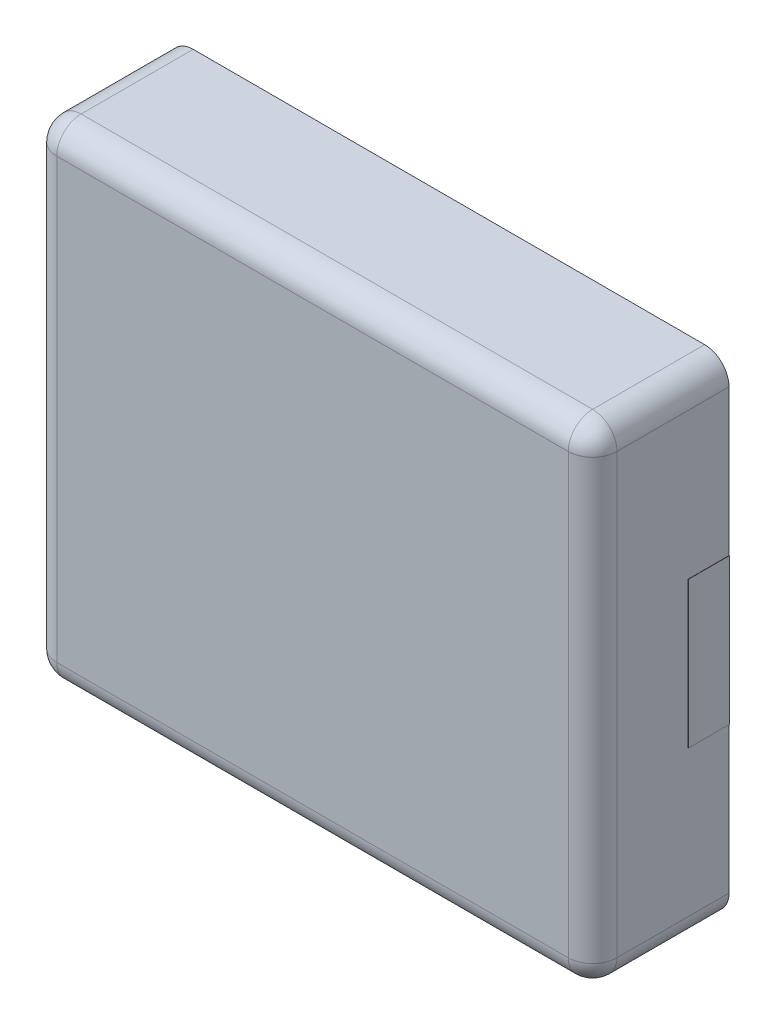
ISO-10303-21;
HEADER;
FILE_DESCRIPTION(('STEP AP214'),'2;1');
FILE_NAME('part.step','',(''),(''),'','','');
FILE_SCHEMA(('AUTOMOTIVE_DESIGN { 1 0 10303 214 1 1 1 1 }'));
ENDSEC;
DATA;
#1=APPLICATION_CONTEXT('core data for automotive mechanical design processes');
#2=APPLICATION_PROTOCOL_DEFINITION('international standard','automotive_design',2000,#1);
#3=PRODUCT_CONTEXT('',#1,'mechanical');
#4=PRODUCT('Part','Part','',(#3));
#5=PRODUCT_RELATED_PRODUCT_CATEGORY('part','',(#4));
#6=PRODUCT_DEFINITION_FORMATION('','',#4);
#7=PRODUCT_DEFINITION_CONTEXT('part definition',#1,'design');
#8=PRODUCT_DEFINITION('design','',#6,#7);
#9=PRODUCT_DEFINITION_SHAPE('','',#8);
#10=(LENGTH_UNIT() NAMED_UNIT(*) SI_UNIT(.MILLI.,.METRE.));
#11=(NAMED_UNIT(*) PLANE_ANGLE_UNIT() SI_UNIT($,.RADIAN.));
#12=(NAMED_UNIT(*) SI_UNIT($,.STERADIAN.) SOLID_ANGLE_UNIT());
#13=UNCERTAINTY_MEASURE_WITH_UNIT(LENGTH_MEASURE(1.E-05),#10,'distance_accuracy_value','');
#14=(GEOMETRIC_REPRESENTATION_CONTEXT(3) GLOBAL_UNCERTAINTY_ASSIGNED_CONTEXT((#13)) GLOBAL_UNIT_ASSIGNED_CONTEXT((#10,
#11,#12)) REPRESENTATION_CONTEXT('',''));
#15=CARTESIAN_POINT('',(0.,0.,0.));
#16=DIRECTION('',(0.,0.,1.));
#17=DIRECTION('',(1.,0.,0.));
#18=AXIS2_PLACEMENT_3D('',#15,#16,#17);
#19=CARTESIAN_POINT('',(5.25,-4.5,2.3));
#20=DIRECTION('',(0.,0.,1.));
#21=DIRECTION('',(1.,0.,0.));
#22=AXIS2_PLACEMENT_3D('',#19,#20,#21);
#23=SPHERICAL_SURFACE('',#22,0.5);
#24=CARTESIAN_POINT('',(5.25,-4.5,2.3));
#25=DIRECTION('',(-1.,0.,0.));
#26=DIRECTION('',(0.,-1.,0.));
#27=AXIS2_PLACEMENT_3D('',#24,#25,#26);
#28=CIRCLE('',#27,0.5);
#29=CARTESIAN_POINT('',(5.25,-5.,2.3));
#30=VERTEX_POINT('',#29);
#31=CARTESIAN_POINT('',(5.25,-4.5,2.8));
#32=VERTEX_POINT('',#31);
#33=EDGE_CURVE('P0_E35',#30,#32,#28,.T.);
#34=ORIENTED_EDGE('',*,*,#33,.F.);
#35=CARTESIAN_POINT('',(5.25,-4.5,2.3));
#36=DIRECTION('',(0.,0.,-1.));
#37=DIRECTION('',(1.,0.,0.));
#38=AXIS2_PLACEMENT_3D('',#35,#36,#37);
#39=CIRCLE('',#38,0.5);
#40=CARTESIAN_POINT('',(5.75,-4.5,2.3));
#41=VERTEX_POINT('',#40);
#42=EDGE_CURVE('P0_E128',#41,#30,#39,.T.);
#43=ORIENTED_EDGE('',*,*,#42,.F.);
#44=CARTESIAN_POINT('',(5.25,-4.5,2.3));
#45=DIRECTION('',(0.,-1.,0.));
#46=DIRECTION('',(1.,0.,0.));
#47=AXIS2_PLACEMENT_3D('',#44,#45,#46);
#48=CIRCLE('',#47,0.5);
#49=EDGE_CURVE('P0_E10',#41,#32,#48,.T.);
#50=ORIENTED_EDGE('',*,*,#49,.T.);
#51=EDGE_LOOP('',(#34,#43,#50));
#52=FACE_BOUND('',#51,.T.);
#53=ADVANCED_FACE('P0_F16',(#52),#23,.T.);
#54=CARTESIAN_POINT('',(3.745,-1.5,0.84));
#55=DIRECTION('',(0.,0.,1.));
#56=DIRECTION('',(1.,0.,0.));
#57=AXIS2_PLACEMENT_3D('',#54,#55,#56);
#58=PLANE('',#57);
#59=DIRECTION('',(0.,-1.,0.));
#60=VECTOR('',#59,1.);
#61=CARTESIAN_POINT('',(5.75,-3.25,0.84));
#62=LINE('',#61,#60);
#63=CARTESIAN_POINT('',(5.75,1.5,0.84));
#64=VERTEX_POINT('',#63);
#65=CARTESIAN_POINT('',(5.75,-1.5,0.84));
#66=VERTEX_POINT('',#65);
#67=EDGE_CURVE('P0_E81',#64,#66,#62,.T.);
#68=ORIENTED_EDGE('',*,*,#67,.T.);
#69=DIRECTION('',(1.,0.,0.));
#70=VECTOR('',#69,1.);
#71=CARTESIAN_POINT('',(3.745,-1.5,0.84));
#72=LINE('',#71,#70);
#73=CARTESIAN_POINT('',(3.745,-1.5,0.84));
#74=VERTEX_POINT('',#73);
#75=EDGE_CURVE('P0_E48',#74,#66,#72,.T.);
#76=ORIENTED_EDGE('',*,*,#75,.F.);
#77=DIRECTION('',(0.,1.,0.));
#78=VECTOR('',#77,1.);
#79=CARTESIAN_POINT('',(3.745,-1.5,0.84));
#80=LINE('',#79,#78);
#81=CARTESIAN_POINT('',(3.745,1.5,0.84));
#82=VERTEX_POINT('',#81);
#83=EDGE_CURVE('P0_E83',#74,#82,#80,.T.);
#84=ORIENTED_EDGE('',*,*,#83,.T.);
#85=DIRECTION('',(1.,0.,0.));
#86=VECTOR('',#85,1.);
#87=CARTESIAN_POINT('',(3.745,1.5,0.84));
#88=LINE('',#87,#86);
#89=EDGE_CURVE('P0_E77',#82,#64,#88,.T.);
#90=ORIENTED_EDGE('',*,*,#89,.T.);
#91=EDGE_LOOP('',(#68,#76,#84,#90));
#92=FACE_BOUND('',#91,.T.);
#93=ADVANCED_FACE('P0_F79',(#92),#58,.F.);
#94=CARTESIAN_POINT('',(5.25,4.5,2.3));
#95=DIRECTION('',(0.,0.,1.));
#96=DIRECTION('',(0.,1.,0.));
#97=AXIS2_PLACEMENT_3D('',#94,#95,#96);
#98=SPHERICAL_SURFACE('',#97,0.5);
#99=CARTESIAN_POINT('',(5.25,4.5,2.3));
#100=DIRECTION('',(0.,-1.,0.));
#101=DIRECTION('',(1.,0.,0.));
#102=AXIS2_PLACEMENT_3D('',#99,#100,#101);
#103=CIRCLE('',#102,0.5);
#104=CARTESIAN_POINT('',(5.75,4.5,2.3));
#105=VERTEX_POINT('',#104);
#106=CARTESIAN_POINT('',(5.25,4.5,2.8));
#107=VERTEX_POINT('',#106);
#108=EDGE_CURVE('P0_E19',#105,#107,#103,.T.);
#109=ORIENTED_EDGE('',*,*,#108,.F.);
#110=CARTESIAN_POINT('',(5.25,4.5,2.3));
#111=DIRECTION('',(0.,0.,-1.));
#112=DIRECTION('',(0.,1.,0.));
#113=AXIS2_PLACEMENT_3D('',#110,#111,#112);
#114=CIRCLE('',#113,0.5);
#115=CARTESIAN_POINT('',(5.25,5.,2.3));
#116=VERTEX_POINT('',#115);
#117=EDGE_CURVE('P0_E154',#116,#105,#114,.T.);
#118=ORIENTED_EDGE('',*,*,#117,.F.);
#119=CARTESIAN_POINT('',(5.25,4.5,2.3));
#120=DIRECTION('',(1.,0.,0.));
#121=DIRECTION('',(0.,1.,0.));
#122=AXIS2_PLACEMENT_3D('',#119,#120,#121);
#123=CIRCLE('',#122,0.5);
#124=EDGE_CURVE('P0_E134',#116,#107,#123,.T.);
#125=ORIENTED_EDGE('',*,*,#124,.T.);
#126=EDGE_LOOP('',(#109,#118,#125));
#127=FACE_BOUND('',#126,.T.);
#128=ADVANCED_FACE('P0_F153',(#127),#98,.T.);
#129=CARTESIAN_POINT('',(5.25,4.5,2.3));
#130=DIRECTION('',(0.,-1.,0.));
#131=DIRECTION('',(1.,0.,0.));
#132=AXIS2_PLACEMENT_3D('',#129,#130,#131);
#133=CYLINDRICAL_SURFACE('',#132,0.5);
#134=ORIENTED_EDGE('',*,*,#108,.T.);
#135=DIRECTION('',(0.,-1.,0.));
#136=VECTOR('',#135,1.);
#137=CARTESIAN_POINT('',(5.25,4.5,2.8));
#138=LINE('',#137,#136);
#139=EDGE_CURVE('P0_E149',#107,#32,#138,.T.);
#140=ORIENTED_EDGE('',*,*,#139,.T.);
#141=ORIENTED_EDGE('',*,*,#49,.F.);
#142=DIRECTION('',(0.,-1.,0.));
#143=VECTOR('',#142,1.);
#144=CARTESIAN_POINT('',(5.75,4.5,2.3));
#145=LINE('',#144,#143);
#146=EDGE_CURVE('P0_E151',#105,#41,#145,.T.);
#147=ORIENTED_EDGE('',*,*,#146,.F.);
#148=EDGE_LOOP('',(#134,#140,#141,#147));
#149=FACE_BOUND('',#148,.T.);
#150=ADVANCED_FACE('P0_F147',(#149),#133,.T.);
#151=CARTESIAN_POINT('',(-5.25,4.5,2.3));
#152=DIRECTION('',(1.,0.,0.));
#153=DIRECTION('',(0.,1.,0.));
#154=AXIS2_PLACEMENT_3D('',#151,#152,#153);
#155=CYLINDRICAL_SURFACE('',#154,0.5);
#156=CARTESIAN_POINT('',(-5.25,4.5,2.3));
#157=DIRECTION('',(1.,0.,0.));
#158=DIRECTION('',(0.,1.,0.));
#159=AXIS2_PLACEMENT_3D('',#156,#157,#158);
#160=CIRCLE('',#159,0.5);
#161=CARTESIAN_POINT('',(-5.25,5.,2.3));
#162=VERTEX_POINT('',#161);
#163=CARTESIAN_POINT('',(-5.25,4.5,2.8));
#164=VERTEX_POINT('',#163);
#165=EDGE_CURVE('P0_E187',#162,#164,#160,.T.);
#166=ORIENTED_EDGE('',*,*,#165,.T.);
#167=DIRECTION('',(1.,0.,0.));
#168=VECTOR('',#167,1.);
#169=CARTESIAN_POINT('',(-5.25,4.5,2.8));
#170=LINE('',#169,#168);
#171=EDGE_CURVE('P0_E192',#164,#107,#170,.T.);
#172=ORIENTED_EDGE('',*,*,#171,.T.);
#173=ORIENTED_EDGE('',*,*,#124,.F.);
#174=DIRECTION('',(1.,0.,0.));
#175=VECTOR('',#174,1.);
#176=CARTESIAN_POINT('',(-5.25,5.,2.3));
#177=LINE('',#176,#175);
#178=EDGE_CURVE('P0_E174',#162,#116,#177,.T.);
#179=ORIENTED_EDGE('',*,*,#178,.F.);
#180=EDGE_LOOP('',(#166,#172,#173,#179));
#181=FACE_BOUND('',#180,.T.);
#182=ADVANCED_FACE('P0_F355',(#181),#155,.T.);
#183=CARTESIAN_POINT('',(5.25,-4.5,2.3));
#184=DIRECTION('',(-1.,0.,0.));
#185=DIRECTION('',(0.,-1.,0.));
#186=AXIS2_PLACEMENT_3D('',#183,#184,#185);
#187=CYLINDRICAL_SURFACE('',#186,0.5);
#188=ORIENTED_EDGE('',*,*,#33,.T.);
#189=DIRECTION('',(-1.,0.,0.));
#190=VECTOR('',#189,1.);
#191=CARTESIAN_POINT('',(5.25,-4.5,2.8));
#192=LINE('',#191,#190);
#193=CARTESIAN_POINT('',(-5.25,-4.5,2.8));
#194=VERTEX_POINT('',#193);
#195=EDGE_CURVE('P0_E244',#32,#194,#192,.T.);
#196=ORIENTED_EDGE('',*,*,#195,.T.);
#197=CARTESIAN_POINT('',(-5.25,-4.5,2.3));
#198=DIRECTION('',(-1.,0.,0.));
#199=DIRECTION('',(0.,-1.,0.));
#200=AXIS2_PLACEMENT_3D('',#197,#198,#199);
#201=CIRCLE('',#200,0.5);
#202=CARTESIAN_POINT('',(-5.25,-5.,2.3));
#203=VERTEX_POINT('',#202);
#204=EDGE_CURVE('P0_E240',#203,#194,#201,.T.);
#205=ORIENTED_EDGE('',*,*,#204,.F.);
#206=DIRECTION('',(-1.,0.,0.));
#207=VECTOR('',#206,1.);
#208=CARTESIAN_POINT('',(5.25,-5.,2.3));
#209=LINE('',#208,#207);
#210=EDGE_CURVE('P0_E127',#30,#203,#209,.T.);
#211=ORIENTED_EDGE('',*,*,#210,.F.);
#212=EDGE_LOOP('',(#188,#196,#205,#211));
#213=FACE_BOUND('',#212,.T.);
#214=ADVANCED_FACE('P0_F326',(#213),#187,.T.);
#215=CARTESIAN_POINT('',(-5.75,-5.,0.));
#216=DIRECTION('',(0.,1.,0.));
#217=DIRECTION('',(1.,0.,0.));
#218=AXIS2_PLACEMENT_3D('',#215,#216,#217);
#219=PLANE('',#218);
#220=DIRECTION('',(1.,0.,0.));
#221=VECTOR('',#220,1.);
#222=CARTESIAN_POINT('',(-5.75,-5.,0.));
#223=LINE('',#222,#221);
#224=CARTESIAN_POINT('',(-5.25,-5.,0.));
#225=VERTEX_POINT('',#224);
#226=CARTESIAN_POINT('',(5.25,-5.,0.));
#227=VERTEX_POINT('',#226);
#228=EDGE_CURVE('P0_E217',#225,#227,#223,.T.);
#229=ORIENTED_EDGE('',*,*,#228,.T.);
#230=DIRECTION('',(0.,0.,1.));
#231=VECTOR('',#230,1.);
#232=CARTESIAN_POINT('',(5.25,-5.,0.));
#233=LINE('',#232,#231);
#234=EDGE_CURVE('P0_E123',#227,#30,#233,.T.);
#235=ORIENTED_EDGE('',*,*,#234,.T.);
#236=ORIENTED_EDGE('',*,*,#210,.T.);
#237=DIRECTION('',(0.,0.,1.));
#238=VECTOR('',#237,1.);
#239=CARTESIAN_POINT('',(-5.25,-5.,0.));
#240=LINE('',#239,#238);
#241=EDGE_CURVE('P0_E241',#225,#203,#240,.T.);
#242=ORIENTED_EDGE('',*,*,#241,.F.);
#243=EDGE_LOOP('',(#229,#235,#236,#242));
#244=FACE_BOUND('',#243,.T.);
#245=ADVANCED_FACE('P0_F329',(#244),#219,.F.);
#246=CARTESIAN_POINT('',(5.25,-4.5,0.));
#247=DIRECTION('',(0.,0.,1.));
#248=DIRECTION('',(1.,0.,0.));
#249=AXIS2_PLACEMENT_3D('',#246,#247,#248);
#250=CYLINDRICAL_SURFACE('',#249,0.5);
#251=ORIENTED_EDGE('',*,*,#42,.T.);
#252=ORIENTED_EDGE('',*,*,#234,.F.);
#253=CARTESIAN_POINT('',(5.25,-4.5,0.));
#254=DIRECTION('',(0.,0.,-1.));
#255=DIRECTION('',(0.,-1.,0.));
#256=AXIS2_PLACEMENT_3D('',#253,#254,#255);
#257=CIRCLE('',#256,0.5);
#258=CARTESIAN_POINT('',(5.75,-4.5,0.));
#259=VERTEX_POINT('',#258);
#260=EDGE_CURVE('P0_E214',#259,#227,#257,.T.);
#261=ORIENTED_EDGE('',*,*,#260,.F.);
#262=DIRECTION('',(0.,0.,1.));
#263=VECTOR('',#262,1.);
#264=CARTESIAN_POINT('',(5.75,-4.5,0.));
#265=LINE('',#264,#263);
#266=EDGE_CURVE('P0_E111',#259,#41,#265,.T.);
#267=ORIENTED_EDGE('',*,*,#266,.T.);
#268=EDGE_LOOP('',(#251,#252,#261,#267));
#269=FACE_BOUND('',#268,.T.);
#270=ADVANCED_FACE('P0_F330',(#269),#250,.T.);
#271=CARTESIAN_POINT('',(3.745,-1.5,0.));
#272=DIRECTION('',(0.,1.,0.));
#273=DIRECTION('',(1.,0.,0.));
#274=AXIS2_PLACEMENT_3D('',#271,#272,#273);
#275=PLANE('',#274);
#276=DIRECTION('',(1.,0.,0.));
#277=VECTOR('',#276,1.);
#278=CARTESIAN_POINT('',(3.745,-1.5,0.));
#279=LINE('',#278,#277);
#280=CARTESIAN_POINT('',(3.745,-1.5,0.));
#281=VERTEX_POINT('',#280);
#282=CARTESIAN_POINT('',(5.75,-1.5,0.));
#283=VERTEX_POINT('',#282);
#284=EDGE_CURVE('P0_E284',#281,#283,#279,.T.);
#285=ORIENTED_EDGE('',*,*,#284,.F.);
#286=DIRECTION('',(0.,0.,1.));
#287=VECTOR('',#286,1.);
#288=CARTESIAN_POINT('',(3.745,-1.5,0.));
#289=LINE('',#288,#287);
#290=EDGE_CURVE('P0_E117',#281,#74,#289,.T.);
#291=ORIENTED_EDGE('',*,*,#290,.T.);
#292=ORIENTED_EDGE('',*,*,#75,.T.);
#293=DIRECTION('',(0.,0.,1.));
#294=VECTOR('',#293,1.);
#295=CARTESIAN_POINT('',(5.75,-1.5,0.));
#296=LINE('',#295,#294);
#297=EDGE_CURVE('P0_E106',#283,#66,#296,.T.);
#298=ORIENTED_EDGE('',*,*,#297,.F.);
#299=EDGE_LOOP('',(#285,#291,#292,#298));
#300=FACE_BOUND('',#299,.T.);
#301=ADVANCED_FACE('P0_F332',(#300),#275,.T.);
#302=CARTESIAN_POINT('',(3.745,-1.5,0.));
#303=DIRECTION('',(1.,0.,0.));
#304=DIRECTION('',(0.,1.,0.));
#305=AXIS2_PLACEMENT_3D('',#302,#303,#304);
#306=PLANE('',#305);
#307=ORIENTED_EDGE('',*,*,#290,.F.);
#308=DIRECTION('',(0.,1.,0.));
#309=VECTOR('',#308,1.);
#310=CARTESIAN_POINT('',(3.745,-1.5,0.));
#311=LINE('',#310,#309);
#312=CARTESIAN_POINT('',(3.745,1.5,0.));
#313=VERTEX_POINT('',#312);
#314=EDGE_CURVE('P0_E281',#281,#313,#311,.T.);
#315=ORIENTED_EDGE('',*,*,#314,.T.);
#316=DIRECTION('',(0.,0.,1.));
#317=VECTOR('',#316,1.);
#318=CARTESIAN_POINT('',(3.745,1.5,0.));
#319=LINE('',#318,#317);
#320=EDGE_CURVE('P0_E88',#313,#82,#319,.T.);
#321=ORIENTED_EDGE('',*,*,#320,.T.);
#322=ORIENTED_EDGE('',*,*,#83,.F.);
#323=EDGE_LOOP('',(#307,#315,#321,#322));
#324=FACE_BOUND('',#323,.T.);
#325=ADVANCED_FACE('P0_F339',(#324),#306,.T.);
#326=CARTESIAN_POINT('',(3.745,1.5,0.));
#327=DIRECTION('',(0.,1.,0.));
#328=DIRECTION('',(1.,0.,0.));
#329=AXIS2_PLACEMENT_3D('',#326,#327,#328);
#330=PLANE('',#329);
#331=DIRECTION('',(0.,0.,1.));
#332=VECTOR('',#331,1.);
#333=CARTESIAN_POINT('',(5.75,1.5,0.));
#334=LINE('',#333,#332);
#335=CARTESIAN_POINT('',(5.75,1.5,0.));
#336=VERTEX_POINT('',#335);
#337=EDGE_CURVE('P0_E89',#336,#64,#334,.T.);
#338=ORIENTED_EDGE('',*,*,#337,.T.);
#339=ORIENTED_EDGE('',*,*,#89,.F.);
#340=ORIENTED_EDGE('',*,*,#320,.F.);
#341=DIRECTION('',(1.,0.,0.));
#342=VECTOR('',#341,1.);
#343=CARTESIAN_POINT('',(3.745,1.5,0.));
#344=LINE('',#343,#342);
#345=EDGE_CURVE('P0_E96',#313,#336,#344,.T.);
#346=ORIENTED_EDGE('',*,*,#345,.T.);
#347=EDGE_LOOP('',(#338,#339,#340,#346));
#348=FACE_BOUND('',#347,.T.);
#349=ADVANCED_FACE('P0_F93',(#348),#330,.F.);
#350=CARTESIAN_POINT('',(5.75,-5.,0.));
#351=DIRECTION('',(1.,0.,0.));
#352=DIRECTION('',(0.,1.,0.));
#353=AXIS2_PLACEMENT_3D('',#350,#351,#352);
#354=PLANE('',#353);
#355=ORIENTED_EDGE('',*,*,#146,.T.);
#356=ORIENTED_EDGE('',*,*,#266,.F.);
#357=DIRECTION('',(0.,1.,0.));
#358=VECTOR('',#357,1.);
#359=CARTESIAN_POINT('',(5.75,-5.,0.));
#360=LINE('',#359,#358);
#361=EDGE_CURVE('P0_E212',#259,#283,#360,.T.);
#362=ORIENTED_EDGE('',*,*,#361,.T.);
#363=ORIENTED_EDGE('',*,*,#297,.T.);
#364=ORIENTED_EDGE('',*,*,#67,.F.);
#365=ORIENTED_EDGE('',*,*,#337,.F.);
#366=DIRECTION('',(0.,1.,0.));
#367=VECTOR('',#366,1.);
#368=CARTESIAN_POINT('',(5.75,-5.,0.));
#369=LINE('',#368,#367);
#370=CARTESIAN_POINT('',(5.75,4.5,0.));
#371=VERTEX_POINT('',#370);
#372=EDGE_CURVE('P0_E275',#336,#371,#369,.T.);
#373=ORIENTED_EDGE('',*,*,#372,.T.);
#374=DIRECTION('',(0.,0.,1.));
#375=VECTOR('',#374,1.);
#376=CARTESIAN_POINT('',(5.75,4.5,0.));
#377=LINE('',#376,#375);
#378=EDGE_CURVE('P0_E160',#371,#105,#377,.T.);
#379=ORIENTED_EDGE('',*,*,#378,.T.);
#380=EDGE_LOOP('',(#355,#356,#362,#363,#364,#365,#373,#379));
#381=FACE_BOUND('',#380,.T.);
#382=ADVANCED_FACE('P0_F103',(#381),#354,.T.);
#383=CARTESIAN_POINT('',(5.25,4.5,0.));
#384=DIRECTION('',(0.,0.,1.));
#385=DIRECTION('',(1.,0.,0.));
#386=AXIS2_PLACEMENT_3D('',#383,#384,#385);
#387=CYLINDRICAL_SURFACE('',#386,0.5);
#388=ORIENTED_EDGE('',*,*,#378,.F.);
#389=CARTESIAN_POINT('',(5.25,4.5,0.));
#390=DIRECTION('',(0.,0.,1.));
#391=DIRECTION('',(0.,-1.,0.));
#392=AXIS2_PLACEMENT_3D('',#389,#390,#391);
#393=CIRCLE('',#392,0.5);
#394=CARTESIAN_POINT('',(5.25,5.,0.));
#395=VERTEX_POINT('',#394);
#396=EDGE_CURVE('P0_E169',#371,#395,#393,.T.);
#397=ORIENTED_EDGE('',*,*,#396,.T.);
#398=DIRECTION('',(0.,0.,1.));
#399=VECTOR('',#398,1.);
#400=CARTESIAN_POINT('',(5.25,5.,0.));
#401=LINE('',#400,#399);
#402=EDGE_CURVE('P0_E164',#395,#116,#401,.T.);
#403=ORIENTED_EDGE('',*,*,#402,.T.);
#404=ORIENTED_EDGE('',*,*,#117,.T.);
#405=EDGE_LOOP('',(#388,#397,#403,#404));
#406=FACE_BOUND('',#405,.T.);
#407=ADVANCED_FACE('P0_F166',(#406),#387,.T.);
#408=CARTESIAN_POINT('',(-3.745,-1.5,0.));
#409=DIRECTION('',(1.,0.,0.));
#410=DIRECTION('',(0.,1.,0.));
#411=AXIS2_PLACEMENT_3D('',#408,#409,#410);
#412=PLANE('',#411);
#413=DIRECTION('',(0.,1.,0.));
#414=VECTOR('',#413,1.);
#415=CARTESIAN_POINT('',(-3.745,-1.5,0.84));
#416=LINE('',#415,#414);
#417=CARTESIAN_POINT('',(-3.745,-1.5,0.84));
#418=VERTEX_POINT('',#417);
#419=CARTESIAN_POINT('',(-3.745,1.5,0.84));
#420=VERTEX_POINT('',#419);
#421=EDGE_CURVE('P0_E227',#418,#420,#416,.T.);
#422=ORIENTED_EDGE('',*,*,#421,.T.);
#423=DIRECTION('',(0.,0.,1.));
#424=VECTOR('',#423,1.);
#425=CARTESIAN_POINT('',(-3.745,1.5,0.));
#426=LINE('',#425,#424);
#427=CARTESIAN_POINT('',(-3.745,1.5,0.));
#428=VERTEX_POINT('',#427);
#429=EDGE_CURVE('P0_E222',#428,#420,#426,.T.);
#430=ORIENTED_EDGE('',*,*,#429,.F.);
#431=DIRECTION('',(0.,1.,0.));
#432=VECTOR('',#431,1.);
#433=CARTESIAN_POINT('',(-3.745,-1.5,0.));
#434=LINE('',#433,#432);
#435=CARTESIAN_POINT('',(-3.745,-1.5,0.));
#436=VERTEX_POINT('',#435);
#437=EDGE_CURVE('P0_E260',#436,#428,#434,.T.);
#438=ORIENTED_EDGE('',*,*,#437,.F.);
#439=DIRECTION('',(0.,0.,1.));
#440=VECTOR('',#439,1.);
#441=CARTESIAN_POINT('',(-3.745,-1.5,0.));
#442=LINE('',#441,#440);
#443=EDGE_CURVE('P0_E235',#436,#418,#442,.T.);
#444=ORIENTED_EDGE('',*,*,#443,.T.);
#445=EDGE_LOOP('',(#422,#430,#438,#444));
#446=FACE_BOUND('',#445,.T.);
#447=ADVANCED_FACE('P0_F420',(#446),#412,.F.);
#448=CARTESIAN_POINT('',(-5.75,5.,0.));
#449=DIRECTION('',(0.,1.,0.));
#450=DIRECTION('',(1.,0.,0.));
#451=AXIS2_PLACEMENT_3D('',#448,#449,#450);
#452=PLANE('',#451);
#453=DIRECTION('',(0.,0.,1.));
#454=VECTOR('',#453,1.);
#455=CARTESIAN_POINT('',(-5.25,5.,0.));
#456=LINE('',#455,#454);
#457=CARTESIAN_POINT('',(-5.25,5.,0.));
#458=VERTEX_POINT('',#457);
#459=EDGE_CURVE('P0_E181',#458,#162,#456,.T.);
#460=ORIENTED_EDGE('',*,*,#459,.T.);
#461=ORIENTED_EDGE('',*,*,#178,.T.);
#462=ORIENTED_EDGE('',*,*,#402,.F.);
#463=DIRECTION('',(1.,0.,0.));
#464=VECTOR('',#463,1.);
#465=CARTESIAN_POINT('',(-5.75,5.,0.));
#466=LINE('',#465,#464);
#467=EDGE_CURVE('P0_E268',#458,#395,#466,.T.);
#468=ORIENTED_EDGE('',*,*,#467,.F.);
#469=EDGE_LOOP('',(#460,#461,#462,#468));
#470=FACE_BOUND('',#469,.T.);
#471=ADVANCED_FACE('P0_F178',(#470),#452,.T.);
#472=CARTESIAN_POINT('',(-5.25,4.5,2.3));
#473=DIRECTION('',(0.,0.,1.));
#474=DIRECTION('',(-1.,0.,0.));
#475=AXIS2_PLACEMENT_3D('',#472,#473,#474);
#476=SPHERICAL_SURFACE('',#475,0.5);
#477=ORIENTED_EDGE('',*,*,#165,.F.);
#478=CARTESIAN_POINT('',(-5.25,4.5,2.3));
#479=DIRECTION('',(0.,0.,-1.));
#480=DIRECTION('',(-1.,0.,0.));
#481=AXIS2_PLACEMENT_3D('',#478,#479,#480);
#482=CIRCLE('',#481,0.5);
#483=CARTESIAN_POINT('',(-5.75,4.5,2.3));
#484=VERTEX_POINT('',#483);
#485=EDGE_CURVE('P0_E578',#484,#162,#482,.T.);
#486=ORIENTED_EDGE('',*,*,#485,.F.);
#487=CARTESIAN_POINT('',(-5.25,4.5,2.3));
#488=DIRECTION('',(0.,1.,0.));
#489=DIRECTION('',(-1.,0.,0.));
#490=AXIS2_PLACEMENT_3D('',#487,#488,#489);
#491=CIRCLE('',#490,0.5);
#492=EDGE_CURVE('P0_E607',#484,#164,#491,.T.);
#493=ORIENTED_EDGE('',*,*,#492,.T.);
#494=EDGE_LOOP('',(#477,#486,#493));
#495=FACE_BOUND('',#494,.T.);
#496=ADVANCED_FACE('P0_F439',(#495),#476,.T.);
#497=CARTESIAN_POINT('',(-5.75,-5.,2.8));
#498=DIRECTION('',(0.,0.,1.));
#499=DIRECTION('',(1.,0.,0.));
#500=AXIS2_PLACEMENT_3D('',#497,#498,#499);
#501=PLANE('',#500);
#502=DIRECTION('',(0.,1.,0.));
#503=VECTOR('',#502,1.);
#504=CARTESIAN_POINT('',(-5.25,-4.5,2.8));
#505=LINE('',#504,#503);
#506=EDGE_CURVE('P0_E603',#194,#164,#505,.T.);
#507=ORIENTED_EDGE('',*,*,#506,.F.);
#508=ORIENTED_EDGE('',*,*,#195,.F.);
#509=ORIENTED_EDGE('',*,*,#139,.F.);
#510=ORIENTED_EDGE('',*,*,#171,.F.);
#511=EDGE_LOOP('',(#507,#508,#509,#510));
#512=FACE_BOUND('',#511,.T.);
#513=ADVANCED_FACE('P0_F449',(#512),#501,.T.);
#514=CARTESIAN_POINT('',(-5.25,-4.5,2.3));
#515=DIRECTION('',(0.,0.,1.));
#516=DIRECTION('',(0.,-1.,0.));
#517=AXIS2_PLACEMENT_3D('',#514,#515,#516);
#518=SPHERICAL_SURFACE('',#517,0.5);
#519=CARTESIAN_POINT('',(-5.25,-4.5,2.3));
#520=DIRECTION('',(0.,1.,0.));
#521=DIRECTION('',(-1.,0.,0.));
#522=AXIS2_PLACEMENT_3D('',#519,#520,#521);
#523=CIRCLE('',#522,0.5);
#524=CARTESIAN_POINT('',(-5.75,-4.5,2.3));
#525=VERTEX_POINT('',#524);
#526=EDGE_CURVE('P0_E600',#525,#194,#523,.T.);
#527=ORIENTED_EDGE('',*,*,#526,.F.);
#528=CARTESIAN_POINT('',(-5.25,-4.5,2.3));
#529=DIRECTION('',(0.,0.,-1.));
#530=DIRECTION('',(0.,-1.,0.));
#531=AXIS2_PLACEMENT_3D('',#528,#529,#530);
#532=CIRCLE('',#531,0.5);
#533=EDGE_CURVE('P0_E236',#203,#525,#532,.T.);
#534=ORIENTED_EDGE('',*,*,#533,.F.);
#535=ORIENTED_EDGE('',*,*,#204,.T.);
#536=EDGE_LOOP('',(#527,#534,#535));
#537=FACE_BOUND('',#536,.T.);
#538=ADVANCED_FACE('P0_F458',(#537),#518,.T.);
#539=CARTESIAN_POINT('',(-5.25,-4.5,0.));
#540=DIRECTION('',(0.,0.,1.));
#541=DIRECTION('',(-1.,0.,0.));
#542=AXIS2_PLACEMENT_3D('',#539,#540,#541);
#543=CYLINDRICAL_SURFACE('',#542,0.5);
#544=DIRECTION('',(0.,0.,1.));
#545=VECTOR('',#544,1.);
#546=CARTESIAN_POINT('',(-5.75,-4.5,0.));
#547=LINE('',#546,#545);
#548=CARTESIAN_POINT('',(-5.75,-4.5,0.));
#549=VERTEX_POINT('',#548);
#550=EDGE_CURVE('P0_E579',#549,#525,#547,.T.);
#551=ORIENTED_EDGE('',*,*,#550,.F.);
#552=CARTESIAN_POINT('',(-5.25,-4.5,0.));
#553=DIRECTION('',(0.,0.,1.));
#554=DIRECTION('',(0.,-1.,0.));
#555=AXIS2_PLACEMENT_3D('',#552,#553,#554);
#556=CIRCLE('',#555,0.5);
#557=EDGE_CURVE('P0_E218',#549,#225,#556,.T.);
#558=ORIENTED_EDGE('',*,*,#557,.T.);
#559=ORIENTED_EDGE('',*,*,#241,.T.);
#560=ORIENTED_EDGE('',*,*,#533,.T.);
#561=EDGE_LOOP('',(#551,#558,#559,#560));
#562=FACE_BOUND('',#561,.T.);
#563=ADVANCED_FACE('P0_F467',(#562),#543,.T.);
#564=CARTESIAN_POINT('',(-5.755,-1.5,0.));
#565=DIRECTION('',(0.,1.,0.));
#566=DIRECTION('',(1.,0.,0.));
#567=AXIS2_PLACEMENT_3D('',#564,#565,#566);
#568=PLANE('',#567);
#569=DIRECTION('',(1.,0.,0.));
#570=VECTOR('',#569,1.);
#571=CARTESIAN_POINT('',(-5.755,-1.5,0.));
#572=LINE('',#571,#570);
#573=CARTESIAN_POINT('',(-5.75,-1.5,0.));
#574=VERTEX_POINT('',#573);
#575=EDGE_CURVE('P0_E264',#574,#436,#572,.T.);
#576=ORIENTED_EDGE('',*,*,#575,.F.);
#577=DIRECTION('',(0.,0.,1.));
#578=VECTOR('',#577,1.);
#579=CARTESIAN_POINT('',(-5.75,-1.5,0.));
#580=LINE('',#579,#578);
#581=CARTESIAN_POINT('',(-5.75,-1.5,0.84));
#582=VERTEX_POINT('',#581);
#583=EDGE_CURVE('P0_E589',#574,#582,#580,.T.);
#584=ORIENTED_EDGE('',*,*,#583,.T.);
#585=DIRECTION('',(1.,0.,0.));
#586=VECTOR('',#585,1.);
#587=CARTESIAN_POINT('',(-5.755,-1.5,0.84));
#588=LINE('',#587,#586);
#589=EDGE_CURVE('P0_E231',#582,#418,#588,.T.);
#590=ORIENTED_EDGE('',*,*,#589,.T.);
#591=ORIENTED_EDGE('',*,*,#443,.F.);
#592=EDGE_LOOP('',(#576,#584,#590,#591));
#593=FACE_BOUND('',#592,.T.);
#594=ADVANCED_FACE('P0_F476',(#593),#568,.T.);
#595=CARTESIAN_POINT('',(-5.755,-1.5,0.84));
#596=DIRECTION('',(0.,0.,1.));
#597=DIRECTION('',(1.,0.,0.));
#598=AXIS2_PLACEMENT_3D('',#595,#596,#597);
#599=PLANE('',#598);
#600=ORIENTED_EDGE('',*,*,#421,.F.);
#601=ORIENTED_EDGE('',*,*,#589,.F.);
#602=DIRECTION('',(0.,-1.,0.));
#603=VECTOR('',#602,1.);
#604=CARTESIAN_POINT('',(-5.75,-3.25,0.84));
#605=LINE('',#604,#603);
#606=CARTESIAN_POINT('',(-5.75,1.5,0.84));
#607=VERTEX_POINT('',#606);
#608=EDGE_CURVE('P0_E575',#607,#582,#605,.T.);
#609=ORIENTED_EDGE('',*,*,#608,.F.);
#610=DIRECTION('',(1.,0.,0.));
#611=VECTOR('',#610,1.);
#612=CARTESIAN_POINT('',(-5.755,1.5,0.84));
#613=LINE('',#612,#611);
#614=EDGE_CURVE('P0_E226',#607,#420,#613,.T.);
#615=ORIENTED_EDGE('',*,*,#614,.T.);
#616=EDGE_LOOP('',(#600,#601,#609,#615));
#617=FACE_BOUND('',#616,.T.);
#618=ADVANCED_FACE('P0_F487',(#617),#599,.F.);
#619=CARTESIAN_POINT('',(-5.755,1.5,0.));
#620=DIRECTION('',(0.,1.,0.));
#621=DIRECTION('',(1.,0.,0.));
#622=AXIS2_PLACEMENT_3D('',#619,#620,#621);
#623=PLANE('',#622);
#624=ORIENTED_EDGE('',*,*,#429,.T.);
#625=ORIENTED_EDGE('',*,*,#614,.F.);
#626=DIRECTION('',(0.,0.,1.));
#627=VECTOR('',#626,1.);
#628=CARTESIAN_POINT('',(-5.75,1.5,0.));
#629=LINE('',#628,#627);
#630=CARTESIAN_POINT('',(-5.75,1.5,0.));
#631=VERTEX_POINT('',#630);
#632=EDGE_CURVE('P0_E570',#631,#607,#629,.T.);
#633=ORIENTED_EDGE('',*,*,#632,.F.);
#634=DIRECTION('',(1.,0.,0.));
#635=VECTOR('',#634,1.);
#636=CARTESIAN_POINT('',(-5.755,1.5,0.));
#637=LINE('',#636,#635);
#638=EDGE_CURVE('P0_E263',#631,#428,#637,.T.);
#639=ORIENTED_EDGE('',*,*,#638,.T.);
#640=EDGE_LOOP('',(#624,#625,#633,#639));
#641=FACE_BOUND('',#640,.T.);
#642=ADVANCED_FACE('P0_F498',(#641),#623,.F.);
#643=CARTESIAN_POINT('',(-5.75,-5.,0.));
#644=DIRECTION('',(0.,0.,1.));
#645=DIRECTION('',(1.,0.,0.));
#646=AXIS2_PLACEMENT_3D('',#643,#644,#645);
#647=PLANE('',#646);
#648=ORIENTED_EDGE('',*,*,#575,.T.);
#649=ORIENTED_EDGE('',*,*,#437,.T.);
#650=ORIENTED_EDGE('',*,*,#638,.F.);
#651=DIRECTION('',(0.,1.,0.));
#652=VECTOR('',#651,1.);
#653=CARTESIAN_POINT('',(-5.75,-5.,0.));
#654=LINE('',#653,#652);
#655=CARTESIAN_POINT('',(-5.75,4.5,0.));
#656=VERTEX_POINT('',#655);
#657=EDGE_CURVE('P0_E556',#631,#656,#654,.T.);
#658=ORIENTED_EDGE('',*,*,#657,.T.);
#659=CARTESIAN_POINT('',(-5.25,4.5,0.));
#660=DIRECTION('',(0.,0.,-1.));
#661=DIRECTION('',(0.,-1.,0.));
#662=AXIS2_PLACEMENT_3D('',#659,#660,#661);
#663=CIRCLE('',#662,0.5);
#664=EDGE_CURVE('P0_E258',#656,#458,#663,.T.);
#665=ORIENTED_EDGE('',*,*,#664,.T.);
#666=ORIENTED_EDGE('',*,*,#467,.T.);
#667=ORIENTED_EDGE('',*,*,#396,.F.);
#668=ORIENTED_EDGE('',*,*,#372,.F.);
#669=ORIENTED_EDGE('',*,*,#345,.F.);
#670=ORIENTED_EDGE('',*,*,#314,.F.);
#671=ORIENTED_EDGE('',*,*,#284,.T.);
#672=ORIENTED_EDGE('',*,*,#361,.F.);
#673=ORIENTED_EDGE('',*,*,#260,.T.);
#674=ORIENTED_EDGE('',*,*,#228,.F.);
#675=ORIENTED_EDGE('',*,*,#557,.F.);
#676=DIRECTION('',(0.,1.,0.));
#677=VECTOR('',#676,1.);
#678=CARTESIAN_POINT('',(-5.75,-5.,0.));
#679=LINE('',#678,#677);
#680=EDGE_CURVE('P0_E582',#549,#574,#679,.T.);
#681=ORIENTED_EDGE('',*,*,#680,.T.);
#682=EDGE_LOOP('',(#648,#649,#650,#658,#665,#666,#667,#668,#669,#670,#671,#672,#673,#674,#675,#681));
#683=FACE_BOUND('',#682,.T.);
#684=ADVANCED_FACE('P0_F299',(#683),#647,.F.);
#685=CARTESIAN_POINT('',(-5.25,4.5,0.));
#686=DIRECTION('',(0.,0.,1.));
#687=DIRECTION('',(-1.,0.,0.));
#688=AXIS2_PLACEMENT_3D('',#685,#686,#687);
#689=CYLINDRICAL_SURFACE('',#688,0.5);
#690=ORIENTED_EDGE('',*,*,#485,.T.);
#691=ORIENTED_EDGE('',*,*,#459,.F.);
#692=ORIENTED_EDGE('',*,*,#664,.F.);
#693=DIRECTION('',(0.,0.,1.));
#694=VECTOR('',#693,1.);
#695=CARTESIAN_POINT('',(-5.75,4.5,0.));
#696=LINE('',#695,#694);
#697=EDGE_CURVE('P0_E552',#656,#484,#696,.T.);
#698=ORIENTED_EDGE('',*,*,#697,.T.);
#699=EDGE_LOOP('',(#690,#691,#692,#698));
#700=FACE_BOUND('',#699,.T.);
#701=ADVANCED_FACE('P0_F515',(#700),#689,.T.);
#702=CARTESIAN_POINT('',(-5.25,-4.5,2.3));
#703=DIRECTION('',(0.,1.,0.));
#704=DIRECTION('',(-1.,0.,0.));
#705=AXIS2_PLACEMENT_3D('',#702,#703,#704);
#706=CYLINDRICAL_SURFACE('',#705,0.5);
#707=ORIENTED_EDGE('',*,*,#526,.T.);
#708=ORIENTED_EDGE('',*,*,#506,.T.);
#709=ORIENTED_EDGE('',*,*,#492,.F.);
#710=DIRECTION('',(0.,1.,0.));
#711=VECTOR('',#710,1.);
#712=CARTESIAN_POINT('',(-5.75,-4.5,2.3));
#713=LINE('',#712,#711);
#714=EDGE_CURVE('P0_E560',#525,#484,#713,.T.);
#715=ORIENTED_EDGE('',*,*,#714,.F.);
#716=EDGE_LOOP('',(#707,#708,#709,#715));
#717=FACE_BOUND('',#716,.T.);
#718=ADVANCED_FACE('P0_F524',(#717),#706,.T.);
#719=CARTESIAN_POINT('',(-5.75,-5.,0.));
#720=DIRECTION('',(1.,0.,0.));
#721=DIRECTION('',(0.,1.,0.));
#722=AXIS2_PLACEMENT_3D('',#719,#720,#721);
#723=PLANE('',#722);
#724=ORIENTED_EDGE('',*,*,#697,.F.);
#725=ORIENTED_EDGE('',*,*,#657,.F.);
#726=ORIENTED_EDGE('',*,*,#632,.T.);
#727=ORIENTED_EDGE('',*,*,#608,.T.);
#728=ORIENTED_EDGE('',*,*,#583,.F.);
#729=ORIENTED_EDGE('',*,*,#680,.F.);
#730=ORIENTED_EDGE('',*,*,#550,.T.);
#731=ORIENTED_EDGE('',*,*,#714,.T.);
#732=EDGE_LOOP('',(#724,#725,#726,#727,#728,#729,#730,#731));
#733=FACE_BOUND('',#732,.T.);
#734=ADVANCED_FACE('P0_F533',(#733),#723,.F.);
#735=CLOSED_SHELL('',(#53,#93,#128,#150,#182,#214,#245,#270,#301,#325,#349,#382,#407,#447,#471,
#496,#513,#538,#563,#594,#618,#642,#684,#701,#718,#734));
#736=MANIFOLD_SOLID_BREP('P0_B1',#735);
#737=CARTESIAN_POINT('',(-5.755,-1.5,0.84));
#738=DIRECTION('',(0.,0.,1.));
#739=DIRECTION('',(1.,0.,0.));
#740=AXIS2_PLACEMENT_3D('',#737,#738,#739);
#741=PLANE('',#740);
#742=DIRECTION('',(0.,1.,0.));
#743=VECTOR('',#742,1.);
#744=CARTESIAN_POINT('',(-5.755,-1.5,0.84));
#745=LINE('',#744,#743);
#746=CARTESIAN_POINT('',(-5.755,-1.5,0.84));
#747=VERTEX_POINT('',#746);
#748=CARTESIAN_POINT('',(-5.755,1.5,0.84));
#749=VERTEX_POINT('',#748);
#750=EDGE_CURVE('P1_E96',#747,#749,#745,.T.);
#751=ORIENTED_EDGE('',*,*,#750,.F.);
#752=DIRECTION('',(1.,0.,0.));
#753=VECTOR('',#752,1.);
#754=CARTESIAN_POINT('',(-5.755,-1.5,0.84));
#755=LINE('',#754,#753);
#756=CARTESIAN_POINT('',(-3.745,-1.5,0.84));
#757=VERTEX_POINT('',#756);
#758=EDGE_CURVE('P1_E79',#747,#757,#755,.T.);
#759=ORIENTED_EDGE('',*,*,#758,.T.);
#760=DIRECTION('',(0.,1.,0.));
#761=VECTOR('',#760,1.);
#762=CARTESIAN_POINT('',(-3.745,-1.5,0.84));
#763=LINE('',#762,#761);
#764=CARTESIAN_POINT('',(-3.745,1.5,0.84));
#765=VERTEX_POINT('',#764);
#766=EDGE_CURVE('P1_E105',#757,#765,#763,.T.);
#767=ORIENTED_EDGE('',*,*,#766,.T.);
#768=DIRECTION('',(1.,0.,0.));
#769=VECTOR('',#768,1.);
#770=CARTESIAN_POINT('',(-5.755,1.5,0.84));
#771=LINE('',#770,#769);
#772=EDGE_CURVE('P1_E11',#749,#765,#771,.T.);
#773=ORIENTED_EDGE('',*,*,#772,.F.);
#774=EDGE_LOOP('',(#751,#759,#767,#773));
#775=FACE_BOUND('',#774,.T.);
#776=ADVANCED_FACE('P1_F17',(#775),#741,.T.);
#777=CARTESIAN_POINT('',(-5.755,-1.5,0.));
#778=DIRECTION('',(0.,0.,1.));
#779=DIRECTION('',(1.,0.,0.));
#780=AXIS2_PLACEMENT_3D('',#777,#778,#779);
#781=PLANE('',#780);
#782=DIRECTION('',(1.,0.,0.));
#783=VECTOR('',#782,1.);
#784=CARTESIAN_POINT('',(-5.755,1.5,0.));
#785=LINE('',#784,#783);
#786=CARTESIAN_POINT('',(-5.755,1.5,0.));
#787=VERTEX_POINT('',#786);
#788=CARTESIAN_POINT('',(-3.745,1.5,0.));
#789=VERTEX_POINT('',#788);
#790=EDGE_CURVE('P1_E20',#787,#789,#785,.T.);
#791=ORIENTED_EDGE('',*,*,#790,.T.);
#792=DIRECTION('',(0.,1.,0.));
#793=VECTOR('',#792,1.);
#794=CARTESIAN_POINT('',(-3.745,-1.5,0.));
#795=LINE('',#794,#793);
#796=CARTESIAN_POINT('',(-3.745,-1.5,0.));
#797=VERTEX_POINT('',#796);
#798=EDGE_CURVE('P1_E74',#797,#789,#795,.T.);
#799=ORIENTED_EDGE('',*,*,#798,.F.);
#800=DIRECTION('',(1.,0.,0.));
#801=VECTOR('',#800,1.);
#802=CARTESIAN_POINT('',(-5.755,-1.5,0.));
#803=LINE('',#802,#801);
#804=CARTESIAN_POINT('',(-5.755,-1.5,0.));
#805=VERTEX_POINT('',#804);
#806=EDGE_CURVE('P1_E67',#805,#797,#803,.T.);
#807=ORIENTED_EDGE('',*,*,#806,.F.);
#808=DIRECTION('',(0.,1.,0.));
#809=VECTOR('',#808,1.);
#810=CARTESIAN_POINT('',(-5.755,-1.5,0.));
#811=LINE('',#810,#809);
#812=EDGE_CURVE('P1_E71',#805,#787,#811,.T.);
#813=ORIENTED_EDGE('',*,*,#812,.T.);
#814=EDGE_LOOP('',(#791,#799,#807,#813));
#815=FACE_BOUND('',#814,.T.);
#816=ADVANCED_FACE('P1_F69',(#815),#781,.F.);
#817=CARTESIAN_POINT('',(-5.755,1.5,0.));
#818=DIRECTION('',(0.,1.,0.));
#819=DIRECTION('',(1.,0.,0.));
#820=AXIS2_PLACEMENT_3D('',#817,#818,#819);
#821=PLANE('',#820);
#822=ORIENTED_EDGE('',*,*,#790,.F.);
#823=DIRECTION('',(0.,0.,1.));
#824=VECTOR('',#823,1.);
#825=CARTESIAN_POINT('',(-5.755,1.5,0.));
#826=LINE('',#825,#824);
#827=EDGE_CURVE('P1_E91',#787,#749,#826,.T.);
#828=ORIENTED_EDGE('',*,*,#827,.T.);
#829=ORIENTED_EDGE('',*,*,#772,.T.);
#830=DIRECTION('',(0.,0.,1.));
#831=VECTOR('',#830,1.);
#832=CARTESIAN_POINT('',(-3.745,1.5,0.));
#833=LINE('',#832,#831);
#834=EDGE_CURVE('P1_E104',#789,#765,#833,.T.);
#835=ORIENTED_EDGE('',*,*,#834,.F.);
#836=EDGE_LOOP('',(#822,#828,#829,#835));
#837=FACE_BOUND('',#836,.T.);
#838=ADVANCED_FACE('P1_F123',(#837),#821,.T.);
#839=CARTESIAN_POINT('',(-5.755,-1.5,0.));
#840=DIRECTION('',(0.,1.,0.));
#841=DIRECTION('',(1.,0.,0.));
#842=AXIS2_PLACEMENT_3D('',#839,#840,#841);
#843=PLANE('',#842);
#844=DIRECTION('',(0.,0.,1.));
#845=VECTOR('',#844,1.);
#846=CARTESIAN_POINT('',(-3.745,-1.5,0.));
#847=LINE('',#846,#845);
#848=EDGE_CURVE('P1_E88',#797,#757,#847,.T.);
#849=ORIENTED_EDGE('',*,*,#848,.T.);
#850=ORIENTED_EDGE('',*,*,#758,.F.);
#851=DIRECTION('',(0.,0.,1.));
#852=VECTOR('',#851,1.);
#853=CARTESIAN_POINT('',(-5.755,-1.5,0.));
#854=LINE('',#853,#852);
#855=EDGE_CURVE('P1_E82',#805,#747,#854,.T.);
#856=ORIENTED_EDGE('',*,*,#855,.F.);
#857=ORIENTED_EDGE('',*,*,#806,.T.);
#858=EDGE_LOOP('',(#849,#850,#856,#857));
#859=FACE_BOUND('',#858,.T.);
#860=ADVANCED_FACE('P1_F83',(#859),#843,.F.);
#861=CARTESIAN_POINT('',(-3.745,-1.5,0.));
#862=DIRECTION('',(1.,0.,0.));
#863=DIRECTION('',(0.,1.,0.));
#864=AXIS2_PLACEMENT_3D('',#861,#862,#863);
#865=PLANE('',#864);
#866=ORIENTED_EDGE('',*,*,#848,.F.);
#867=ORIENTED_EDGE('',*,*,#798,.T.);
#868=ORIENTED_EDGE('',*,*,#834,.T.);
#869=ORIENTED_EDGE('',*,*,#766,.F.);
#870=EDGE_LOOP('',(#866,#867,#868,#869));
#871=FACE_BOUND('',#870,.T.);
#872=ADVANCED_FACE('P1_F114',(#871),#865,.T.);
#873=CARTESIAN_POINT('',(-5.755,-1.5,0.));
#874=DIRECTION('',(1.,0.,0.));
#875=DIRECTION('',(0.,1.,0.));
#876=AXIS2_PLACEMENT_3D('',#873,#874,#875);
#877=PLANE('',#876);
#878=ORIENTED_EDGE('',*,*,#750,.T.);
#879=ORIENTED_EDGE('',*,*,#827,.F.);
#880=ORIENTED_EDGE('',*,*,#812,.F.);
#881=ORIENTED_EDGE('',*,*,#855,.T.);
#882=EDGE_LOOP('',(#878,#879,#880,#881));
#883=FACE_BOUND('',#882,.T.);
#884=ADVANCED_FACE('P1_F90',(#883),#877,.F.);
#885=CLOSED_SHELL('',(#776,#816,#838,#860,#872,#884));
#886=MANIFOLD_SOLID_BREP('P1_B1',#885);
#887=CARTESIAN_POINT('',(3.745,-1.5,0.84));
#888=DIRECTION('',(0.,0.,1.));
#889=DIRECTION('',(1.,0.,0.));
#890=AXIS2_PLACEMENT_3D('',#887,#888,#889);
#891=PLANE('',#890);
#892=DIRECTION('',(0.,1.,0.));
#893=VECTOR('',#892,1.);
#894=CARTESIAN_POINT('',(3.745,-1.5,0.84));
#895=LINE('',#894,#893);
#896=CARTESIAN_POINT('',(3.745,-1.5,0.84));
#897=VERTEX_POINT('',#896);
#898=CARTESIAN_POINT('',(3.745,1.5,0.84));
#899=VERTEX_POINT('',#898);
#900=EDGE_CURVE('P2_E59',#897,#899,#895,.T.);
#901=ORIENTED_EDGE('',*,*,#900,.F.);
#902=DIRECTION('',(1.,0.,0.));
#903=VECTOR('',#902,1.);
#904=CARTESIAN_POINT('',(3.745,-1.5,0.84));
#905=LINE('',#904,#903);
#906=CARTESIAN_POINT('',(5.755,-1.5,0.84));
#907=VERTEX_POINT('',#906);
#908=EDGE_CURVE('P2_E53',#897,#907,#905,.T.);
#909=ORIENTED_EDGE('',*,*,#908,.T.);
#910=DIRECTION('',(0.,1.,0.));
#911=VECTOR('',#910,1.);
#912=CARTESIAN_POINT('',(5.755,-1.5,0.84));
#913=LINE('',#912,#911);
#914=CARTESIAN_POINT('',(5.755,1.5,0.84));
#915=VERTEX_POINT('',#914);
#916=EDGE_CURVE('P2_E55',#907,#915,#913,.T.);
#917=ORIENTED_EDGE('',*,*,#916,.T.);
#918=DIRECTION('',(1.,0.,0.));
#919=VECTOR('',#918,1.);
#920=CARTESIAN_POINT('',(3.745,1.5,0.84));
#921=LINE('',#920,#919);
#922=EDGE_CURVE('P2_E11',#899,#915,#921,.T.);
#923=ORIENTED_EDGE('',*,*,#922,.F.);
#924=EDGE_LOOP('',(#901,#909,#917,#923));
#925=FACE_BOUND('',#924,.T.);
#926=ADVANCED_FACE('P2_F17',(#925),#891,.T.);
#927=CARTESIAN_POINT('',(3.745,-1.5,0.));
#928=DIRECTION('',(0.,0.,1.));
#929=DIRECTION('',(1.,0.,0.));
#930=AXIS2_PLACEMENT_3D('',#927,#928,#929);
#931=PLANE('',#930);
#932=DIRECTION('',(1.,0.,0.));
#933=VECTOR('',#932,1.);
#934=CARTESIAN_POINT('',(3.745,1.5,0.));
#935=LINE('',#934,#933);
#936=CARTESIAN_POINT('',(3.745,1.5,0.));
#937=VERTEX_POINT('',#936);
#938=CARTESIAN_POINT('',(5.755,1.5,0.));
#939=VERTEX_POINT('',#938);
#940=EDGE_CURVE('P2_E26',#937,#939,#935,.T.);
#941=ORIENTED_EDGE('',*,*,#940,.T.);
#942=DIRECTION('',(0.,1.,0.));
#943=VECTOR('',#942,1.);
#944=CARTESIAN_POINT('',(5.755,-1.5,0.));
#945=LINE('',#944,#943);
#946=CARTESIAN_POINT('',(5.755,-1.5,0.));
#947=VERTEX_POINT('',#946);
#948=EDGE_CURVE('P2_E79',#947,#939,#945,.T.);
#949=ORIENTED_EDGE('',*,*,#948,.F.);
#950=DIRECTION('',(1.,0.,0.));
#951=VECTOR('',#950,1.);
#952=CARTESIAN_POINT('',(3.745,-1.5,0.));
#953=LINE('',#952,#951);
#954=CARTESIAN_POINT('',(3.745,-1.5,0.));
#955=VERTEX_POINT('',#954);
#956=EDGE_CURVE('P2_E65',#955,#947,#953,.T.);
#957=ORIENTED_EDGE('',*,*,#956,.F.);
#958=DIRECTION('',(0.,1.,0.));
#959=VECTOR('',#958,1.);
#960=CARTESIAN_POINT('',(3.745,-1.5,0.));
#961=LINE('',#960,#959);
#962=EDGE_CURVE('P2_E87',#955,#937,#961,.T.);
#963=ORIENTED_EDGE('',*,*,#962,.T.);
#964=EDGE_LOOP('',(#941,#949,#957,#963));
#965=FACE_BOUND('',#964,.T.);
#966=ADVANCED_FACE('P2_F136',(#965),#931,.F.);
#967=CARTESIAN_POINT('',(3.745,1.5,0.));
#968=DIRECTION('',(0.,1.,0.));
#969=DIRECTION('',(1.,0.,0.));
#970=AXIS2_PLACEMENT_3D('',#967,#968,#969);
#971=PLANE('',#970);
#972=ORIENTED_EDGE('',*,*,#940,.F.);
#973=DIRECTION('',(0.,0.,1.));
#974=VECTOR('',#973,1.);
#975=CARTESIAN_POINT('',(3.745,1.5,0.));
#976=LINE('',#975,#974);
#977=EDGE_CURVE('P2_E91',#937,#899,#976,.T.);
#978=ORIENTED_EDGE('',*,*,#977,.T.);
#979=ORIENTED_EDGE('',*,*,#922,.T.);
#980=DIRECTION('',(0.,0.,1.));
#981=VECTOR('',#980,1.);
#982=CARTESIAN_POINT('',(5.755,1.5,0.));
#983=LINE('',#982,#981);
#984=EDGE_CURVE('P2_E72',#939,#915,#983,.T.);
#985=ORIENTED_EDGE('',*,*,#984,.F.);
#986=EDGE_LOOP('',(#972,#978,#979,#985));
#987=FACE_BOUND('',#986,.T.);
#988=ADVANCED_FACE('P2_F128',(#987),#971,.T.);
#989=CARTESIAN_POINT('',(3.745,-1.5,0.));
#990=DIRECTION('',(0.,1.,0.));
#991=DIRECTION('',(1.,0.,0.));
#992=AXIS2_PLACEMENT_3D('',#989,#990,#991);
#993=PLANE('',#992);
#994=DIRECTION('',(0.,0.,1.));
#995=VECTOR('',#994,1.);
#996=CARTESIAN_POINT('',(5.755,-1.5,0.));
#997=LINE('',#996,#995);
#998=EDGE_CURVE('P2_E71',#947,#907,#997,.T.);
#999=ORIENTED_EDGE('',*,*,#998,.T.);
#1000=ORIENTED_EDGE('',*,*,#908,.F.);
#1001=DIRECTION('',(0.,0.,1.));
#1002=VECTOR('',#1001,1.);
#1003=CARTESIAN_POINT('',(3.745,-1.5,0.));
#1004=LINE('',#1003,#1002);
#1005=EDGE_CURVE('P2_E80',#955,#897,#1004,.T.);
#1006=ORIENTED_EDGE('',*,*,#1005,.F.);
#1007=ORIENTED_EDGE('',*,*,#956,.T.);
#1008=EDGE_LOOP('',(#999,#1000,#1006,#1007));
#1009=FACE_BOUND('',#1008,.T.);
#1010=ADVANCED_FACE('P2_F75',(#1009),#993,.F.);
#1011=CARTESIAN_POINT('',(5.755,-1.5,0.));
#1012=DIRECTION('',(1.,0.,0.));
#1013=DIRECTION('',(0.,1.,0.));
#1014=AXIS2_PLACEMENT_3D('',#1011,#1012,#1013);
#1015=PLANE('',#1014);
#1016=ORIENTED_EDGE('',*,*,#998,.F.);
#1017=ORIENTED_EDGE('',*,*,#948,.T.);
#1018=ORIENTED_EDGE('',*,*,#984,.T.);
#1019=ORIENTED_EDGE('',*,*,#916,.F.);
#1020=EDGE_LOOP('',(#1016,#1017,#1018,#1019));
#1021=FACE_BOUND('',#1020,.T.);
#1022=ADVANCED_FACE('P2_F69',(#1021),#1015,.T.);
#1023=CARTESIAN_POINT('',(3.745,-1.5,0.));
#1024=DIRECTION('',(1.,0.,0.));
#1025=DIRECTION('',(0.,1.,0.));
#1026=AXIS2_PLACEMENT_3D('',#1023,#1024,#1025);
#1027=PLANE('',#1026);
#1028=ORIENTED_EDGE('',*,*,#900,.T.);
#1029=ORIENTED_EDGE('',*,*,#977,.F.);
#1030=ORIENTED_EDGE('',*,*,#962,.F.);
#1031=ORIENTED_EDGE('',*,*,#1005,.T.);
#1032=EDGE_LOOP('',(#1028,#1029,#1030,#1031));
#1033=FACE_BOUND('',#1032,.T.);
#1034=ADVANCED_FACE('P2_F107',(#1033),#1027,.F.);
#1035=CLOSED_SHELL('',(#926,#966,#988,#1010,#1022,#1034));
#1036=MANIFOLD_SOLID_BREP('P2_B1',#1035);
#1037=ADVANCED_BREP_SHAPE_REPRESENTATION('',(#18,#736,#886,#1036),#14);
#1038=SHAPE_DEFINITION_REPRESENTATION(#9,#1037);
ENDSEC;
END-ISO-10303-21;
